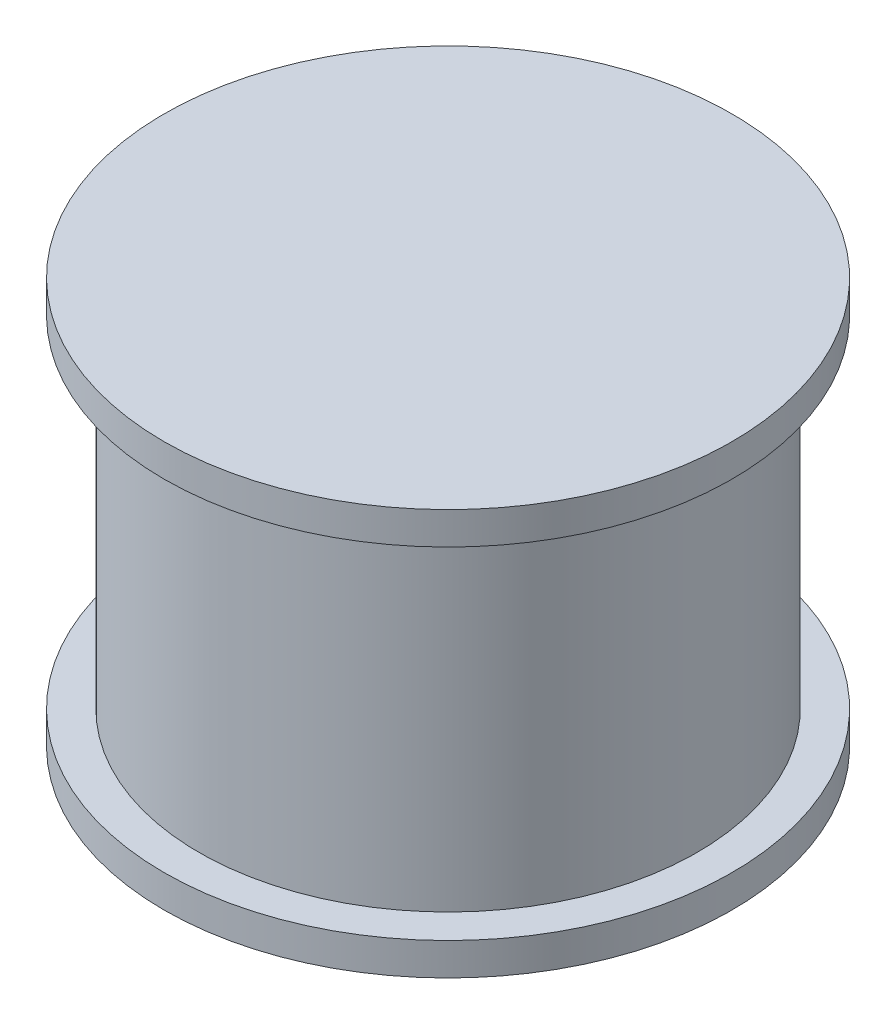
ISO-10303-21;
HEADER;
FILE_DESCRIPTION(('STEP AP214'),'2;1');
FILE_NAME('part.step','',(''),(''),'','','');
FILE_SCHEMA(('AUTOMOTIVE_DESIGN { 1 0 10303 214 1 1 1 1 }'));
ENDSEC;
DATA;
#1=APPLICATION_CONTEXT('core data for automotive mechanical design processes');
#2=APPLICATION_PROTOCOL_DEFINITION('international standard','automotive_design',2000,#1);
#3=PRODUCT_CONTEXT('',#1,'mechanical');
#4=PRODUCT('Part','Part','',(#3));
#5=PRODUCT_RELATED_PRODUCT_CATEGORY('part','',(#4));
#6=PRODUCT_DEFINITION_FORMATION('','',#4);
#7=PRODUCT_DEFINITION_CONTEXT('part definition',#1,'design');
#8=PRODUCT_DEFINITION('design','',#6,#7);
#9=PRODUCT_DEFINITION_SHAPE('','',#8);
#10=(LENGTH_UNIT() NAMED_UNIT(*) SI_UNIT(.MILLI.,.METRE.));
#11=(NAMED_UNIT(*) PLANE_ANGLE_UNIT() SI_UNIT($,.RADIAN.));
#12=(NAMED_UNIT(*) SI_UNIT($,.STERADIAN.) SOLID_ANGLE_UNIT());
#13=UNCERTAINTY_MEASURE_WITH_UNIT(LENGTH_MEASURE(1.E-05),#10,'distance_accuracy_value','');
#14=(GEOMETRIC_REPRESENTATION_CONTEXT(3) GLOBAL_UNCERTAINTY_ASSIGNED_CONTEXT((#13)) GLOBAL_UNIT_ASSIGNED_CONTEXT((#10,
#11,#12)) REPRESENTATION_CONTEXT('',''));
#15=CARTESIAN_POINT('',(0.,0.,0.));
#16=DIRECTION('',(0.,0.,1.));
#17=DIRECTION('',(1.,0.,0.));
#18=AXIS2_PLACEMENT_3D('',#15,#16,#17);
#19=CARTESIAN_POINT('',(0.,10.5,0.));
#20=DIRECTION('',(0.,-1.,0.));
#21=DIRECTION('',(0.,0.,-1.));
#22=AXIS2_PLACEMENT_3D('',#19,#20,#21);
#23=CYLINDRICAL_SURFACE('',#22,15.35);
#24=CARTESIAN_POINT('',(0.,10.5,0.));
#25=DIRECTION('',(0.,1.,0.));
#26=DIRECTION('',(0.,0.,1.));
#27=AXIS2_PLACEMENT_3D('',#24,#25,#26);
#28=CIRCLE('',#27,15.35);
#29=CARTESIAN_POINT('',(0.,10.5,-15.35));
#30=VERTEX_POINT('',#29);
#31=EDGE_CURVE('E10',#30,#30,#28,.T.);
#32=CARTESIAN_POINT('',(0.,-10.5,0.));
#33=DIRECTION('',(0.,1.,0.));
#34=DIRECTION('',(0.,0.,1.));
#35=AXIS2_PLACEMENT_3D('',#32,#33,#34);
#36=CIRCLE('',#35,15.35);
#37=CARTESIAN_POINT('',(0.,-10.5,-15.35));
#38=VERTEX_POINT('',#37);
#39=EDGE_CURVE('E42',#38,#38,#36,.T.);
#40=CARTESIAN_POINT('',(0.,10.5,-15.35));
#41=CARTESIAN_POINT('',(0.,10.28125,-15.35));
#42=CARTESIAN_POINT('',(0.,10.0625,-15.35));
#43=CARTESIAN_POINT('',(0.,9.625,-15.35));
#44=CARTESIAN_POINT('',(0.,9.40625,-15.35));
#45=CARTESIAN_POINT('',(0.,8.96875,-15.35));
#46=CARTESIAN_POINT('',(0.,8.75,-15.35));
#47=CARTESIAN_POINT('',(0.,8.3125,-15.35));
#48=CARTESIAN_POINT('',(0.,8.09375,-15.35));
#49=CARTESIAN_POINT('',(0.,7.65625,-15.35));
#50=CARTESIAN_POINT('',(0.,7.4375,-15.35));
#51=CARTESIAN_POINT('',(0.,7.,-15.35));
#52=CARTESIAN_POINT('',(0.,6.78125,-15.35));
#53=CARTESIAN_POINT('',(0.,6.34375,-15.35));
#54=CARTESIAN_POINT('',(0.,6.125,-15.35));
#55=CARTESIAN_POINT('',(0.,5.6875,-15.35));
#56=CARTESIAN_POINT('',(0.,5.46875,-15.35));
#57=CARTESIAN_POINT('',(0.,5.03125,-15.35));
#58=CARTESIAN_POINT('',(0.,4.8125,-15.35));
#59=CARTESIAN_POINT('',(0.,4.375,-15.35));
#60=CARTESIAN_POINT('',(0.,4.15625,-15.35));
#61=CARTESIAN_POINT('',(0.,3.71875,-15.35));
#62=CARTESIAN_POINT('',(0.,3.5,-15.35));
#63=CARTESIAN_POINT('',(0.,3.0625,-15.35));
#64=CARTESIAN_POINT('',(0.,2.84375,-15.35));
#65=CARTESIAN_POINT('',(0.,2.40625,-15.35));
#66=CARTESIAN_POINT('',(0.,2.1875,-15.35));
#67=CARTESIAN_POINT('',(0.,1.75,-15.35));
#68=CARTESIAN_POINT('',(0.,1.53125,-15.35));
#69=CARTESIAN_POINT('',(0.,1.09375,-15.35));
#70=CARTESIAN_POINT('',(0.,0.875000000000001,-15.35));
#71=CARTESIAN_POINT('',(0.,0.4375,-15.35));
#72=CARTESIAN_POINT('',(0.,0.21875,-15.35));
#73=CARTESIAN_POINT('',(0.,-0.21875,-15.35));
#74=CARTESIAN_POINT('',(0.,-0.4375,-15.35));
#75=CARTESIAN_POINT('',(0.,-0.875000000000001,-15.35));
#76=CARTESIAN_POINT('',(0.,-1.09375,-15.35));
#77=CARTESIAN_POINT('',(0.,-1.53125,-15.35));
#78=CARTESIAN_POINT('',(0.,-1.75,-15.35));
#79=CARTESIAN_POINT('',(0.,-2.1875,-15.35));
#80=CARTESIAN_POINT('',(0.,-2.40625,-15.35));
#81=CARTESIAN_POINT('',(0.,-2.84375,-15.35));
#82=CARTESIAN_POINT('',(0.,-3.0625,-15.35));
#83=CARTESIAN_POINT('',(0.,-3.5,-15.35));
#84=CARTESIAN_POINT('',(0.,-3.71875,-15.35));
#85=CARTESIAN_POINT('',(0.,-4.15625,-15.35));
#86=CARTESIAN_POINT('',(0.,-4.375,-15.35));
#87=CARTESIAN_POINT('',(0.,-4.8125,-15.35));
#88=CARTESIAN_POINT('',(0.,-5.03125,-15.35));
#89=CARTESIAN_POINT('',(0.,-5.46875,-15.35));
#90=CARTESIAN_POINT('',(0.,-5.6875,-15.35));
#91=CARTESIAN_POINT('',(0.,-6.125,-15.35));
#92=CARTESIAN_POINT('',(0.,-6.34375,-15.35));
#93=CARTESIAN_POINT('',(0.,-6.78125,-15.35));
#94=CARTESIAN_POINT('',(0.,-7.,-15.35));
#95=CARTESIAN_POINT('',(0.,-7.4375,-15.35));
#96=CARTESIAN_POINT('',(0.,-7.65625,-15.35));
#97=CARTESIAN_POINT('',(0.,-8.09375,-15.35));
#98=CARTESIAN_POINT('',(0.,-8.3125,-15.35));
#99=CARTESIAN_POINT('',(0.,-8.75,-15.35));
#100=CARTESIAN_POINT('',(0.,-8.96875,-15.35));
#101=CARTESIAN_POINT('',(0.,-9.40625,-15.35));
#102=CARTESIAN_POINT('',(0.,-9.625,-15.35));
#103=CARTESIAN_POINT('',(0.,-10.0625,-15.35));
#104=CARTESIAN_POINT('',(0.,-10.28125,-15.35));
#105=CARTESIAN_POINT('',(0.,-10.5,-15.35));
#106=B_SPLINE_CURVE_WITH_KNOTS('',3,(#40,#41,#42,#43,#44,#45,#46,#47,#48,#49,#50,#51,#52,#53,
#54,#55,#56,#57,#58,#59,#60,#61,#62,#63,#64,#65,#66,#67,#68,#69,#70,#71,#72,#73,#74,#75,#76,#77,
#78,#79,#80,#81,#82,#83,#84,#85,#86,#87,#88,#89,#90,#91,#92,#93,#94,#95,#96,#97,#98,#99,#100,
#101,#102,#103,#104,#105),.UNSPECIFIED.,.F.,.F.,(4,2,2,2,2,2,2,2,2,2,2,2,2,2,2,2,2,2,2,2,2,2,2,
2,2,2,2,2,2,2,2,2,4),(0.,0.656250000000001,1.3125,1.96875,2.625,3.28125,3.9375,4.59375,5.25,
5.90625,6.5625,7.21875,7.875,8.53125,9.1875,9.84375,10.5,11.15625,11.8125,12.46875,13.125,
13.78125,14.4375,15.09375,15.75,16.40625,17.0625,17.71875,18.375,19.03125,19.6875,20.34375,21.),.UNSPECIFIED.);
#107=EDGE_CURVE('BSEAM39',#30,#38,#106,.T.);
#108=ORIENTED_EDGE('',*,*,#31,.F.);
#109=ORIENTED_EDGE('',*,*,#39,.T.);
#110=ORIENTED_EDGE('',*,*,#107,.T.);
#111=ORIENTED_EDGE('',*,*,#107,.F.);
#112=EDGE_LOOP('',(#108,#110,#109,#111));
#113=FACE_BOUND('',#112,.T.);
#114=ADVANCED_FACE('F39',(#113),#23,.T.);
#115=CARTESIAN_POINT('',(0.,12.5,0.));
#116=DIRECTION('',(0.,-1.,0.));
#117=DIRECTION('',(0.,0.,-1.));
#118=AXIS2_PLACEMENT_3D('',#115,#116,#117);
#119=CYLINDRICAL_SURFACE('',#118,17.5);
#120=CARTESIAN_POINT('',(0.,12.5,0.));
#121=DIRECTION('',(0.,1.,0.));
#122=DIRECTION('',(0.,0.,1.));
#123=AXIS2_PLACEMENT_3D('',#120,#121,#122);
#124=CIRCLE('',#123,17.5);
#125=CARTESIAN_POINT('',(0.,12.5,17.5));
#126=VERTEX_POINT('',#125);
#127=EDGE_CURVE('E46',#126,#126,#124,.T.);
#128=ORIENTED_EDGE('',*,*,#127,.F.);
#129=EDGE_LOOP('',(#128));
#130=FACE_BOUND('',#129,.T.);
#131=CARTESIAN_POINT('',(0.,10.5,0.));
#132=DIRECTION('',(0.,1.,0.));
#133=DIRECTION('',(0.,0.,1.));
#134=AXIS2_PLACEMENT_3D('',#131,#132,#133);
#135=CIRCLE('',#134,17.5);
#136=CARTESIAN_POINT('',(0.,10.5,17.5));
#137=VERTEX_POINT('',#136);
#138=EDGE_CURVE('E50',#137,#137,#135,.T.);
#139=ORIENTED_EDGE('',*,*,#138,.T.);
#140=EDGE_LOOP('',(#139));
#141=FACE_BOUND('',#140,.T.);
#142=ADVANCED_FACE('F87',(#130,#141),#119,.T.);
#143=CARTESIAN_POINT('',(0.,12.5,0.));
#144=DIRECTION('',(0.,1.,0.));
#145=DIRECTION('',(0.,0.,1.));
#146=AXIS2_PLACEMENT_3D('',#143,#144,#145);
#147=PLANE('',#146);
#148=ORIENTED_EDGE('',*,*,#127,.T.);
#149=EDGE_LOOP('',(#148));
#150=FACE_BOUND('',#149,.T.);
#151=ADVANCED_FACE('F83',(#150),#147,.T.);
#152=CARTESIAN_POINT('',(0.,10.5,0.));
#153=DIRECTION('',(0.,1.,0.));
#154=DIRECTION('',(0.,0.,1.));
#155=AXIS2_PLACEMENT_3D('',#152,#153,#154);
#156=PLANE('',#155);
#157=ORIENTED_EDGE('',*,*,#31,.T.);
#158=EDGE_LOOP('',(#157));
#159=FACE_BOUND('',#158,.T.);
#160=ORIENTED_EDGE('',*,*,#138,.F.);
#161=EDGE_LOOP('',(#160));
#162=FACE_BOUND('',#161,.T.);
#163=ADVANCED_FACE('F75',(#159,#162),#156,.F.);
#164=CARTESIAN_POINT('',(0.,-12.5,0.));
#165=DIRECTION('',(0.,1.,0.));
#166=DIRECTION('',(0.,0.,1.));
#167=AXIS2_PLACEMENT_3D('',#164,#165,#166);
#168=CYLINDRICAL_SURFACE('',#167,17.5);
#169=CARTESIAN_POINT('',(0.,-12.5,0.));
#170=DIRECTION('',(0.,1.,0.));
#171=DIRECTION('',(0.,0.,1.));
#172=AXIS2_PLACEMENT_3D('',#169,#170,#171);
#173=CIRCLE('',#172,17.5);
#174=CARTESIAN_POINT('',(0.,-12.5,17.5));
#175=VERTEX_POINT('',#174);
#176=EDGE_CURVE('E58',#175,#175,#173,.T.);
#177=ORIENTED_EDGE('',*,*,#176,.T.);
#178=EDGE_LOOP('',(#177));
#179=FACE_BOUND('',#178,.T.);
#180=CARTESIAN_POINT('',(0.,-10.5,0.));
#181=DIRECTION('',(0.,1.,0.));
#182=DIRECTION('',(0.,0.,1.));
#183=AXIS2_PLACEMENT_3D('',#180,#181,#182);
#184=CIRCLE('',#183,17.5);
#185=CARTESIAN_POINT('',(0.,-10.5,17.5));
#186=VERTEX_POINT('',#185);
#187=EDGE_CURVE('E55',#186,#186,#184,.T.);
#188=ORIENTED_EDGE('',*,*,#187,.F.);
#189=EDGE_LOOP('',(#188));
#190=FACE_BOUND('',#189,.T.);
#191=ADVANCED_FACE('F73',(#179,#190),#168,.T.);
#192=CARTESIAN_POINT('',(0.,-12.5,0.));
#193=DIRECTION('',(0.,-1.,0.));
#194=DIRECTION('',(0.,0.,1.));
#195=AXIS2_PLACEMENT_3D('',#192,#193,#194);
#196=PLANE('',#195);
#197=ORIENTED_EDGE('',*,*,#176,.F.);
#198=EDGE_LOOP('',(#197));
#199=FACE_BOUND('',#198,.T.);
#200=ADVANCED_FACE('F69',(#199),#196,.T.);
#201=CARTESIAN_POINT('',(0.,-10.5,0.));
#202=DIRECTION('',(0.,-1.,0.));
#203=DIRECTION('',(0.,0.,1.));
#204=AXIS2_PLACEMENT_3D('',#201,#202,#203);
#205=PLANE('',#204);
#206=ORIENTED_EDGE('',*,*,#39,.F.);
#207=EDGE_LOOP('',(#206));
#208=FACE_BOUND('',#207,.T.);
#209=ORIENTED_EDGE('',*,*,#187,.T.);
#210=EDGE_LOOP('',(#209));
#211=FACE_BOUND('',#210,.T.);
#212=ADVANCED_FACE('F66',(#208,#211),#205,.F.);
#213=CLOSED_SHELL('',(#114,#142,#151,#163,#191,#200,#212));
#214=MANIFOLD_SOLID_BREP('B2',#213);
#215=ADVANCED_BREP_SHAPE_REPRESENTATION('',(#18,#214),#14);
#216=SHAPE_DEFINITION_REPRESENTATION(#9,#215);
ENDSEC;
END-ISO-10303-21;
